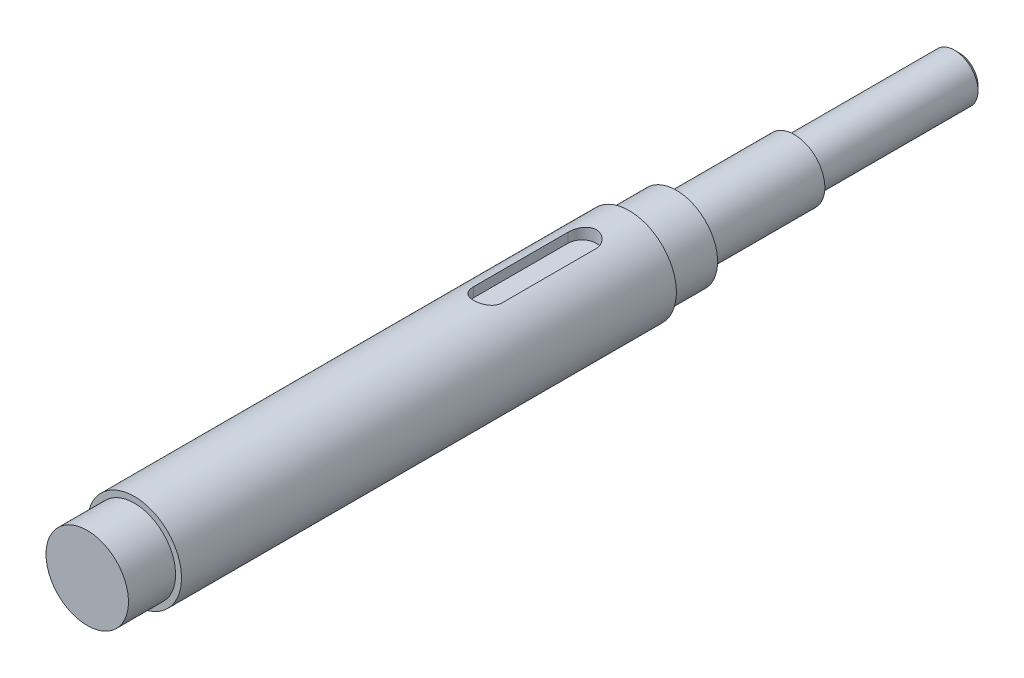
ISO-10303-21;
HEADER;
FILE_DESCRIPTION(('STEP AP214'),'2;1');
FILE_NAME('part.step','',(''),(''),'','','');
FILE_SCHEMA(('AUTOMOTIVE_DESIGN { 1 0 10303 214 1 1 1 1 }'));
ENDSEC;
DATA;
#1=APPLICATION_CONTEXT('core data for automotive mechanical design processes');
#2=APPLICATION_PROTOCOL_DEFINITION('international standard','automotive_design',2000,#1);
#3=PRODUCT_CONTEXT('',#1,'mechanical');
#4=PRODUCT('Part','Part','',(#3));
#5=PRODUCT_RELATED_PRODUCT_CATEGORY('part','',(#4));
#6=PRODUCT_DEFINITION_FORMATION('','',#4);
#7=PRODUCT_DEFINITION_CONTEXT('part definition',#1,'design');
#8=PRODUCT_DEFINITION('design','',#6,#7);
#9=PRODUCT_DEFINITION_SHAPE('','',#8);
#10=(LENGTH_UNIT() NAMED_UNIT(*) SI_UNIT(.MILLI.,.METRE.));
#11=(NAMED_UNIT(*) PLANE_ANGLE_UNIT() SI_UNIT($,.RADIAN.));
#12=(NAMED_UNIT(*) SI_UNIT($,.STERADIAN.) SOLID_ANGLE_UNIT());
#13=UNCERTAINTY_MEASURE_WITH_UNIT(LENGTH_MEASURE(1.E-05),#10,'distance_accuracy_value','');
#14=(GEOMETRIC_REPRESENTATION_CONTEXT(3) GLOBAL_UNCERTAINTY_ASSIGNED_CONTEXT((#13)) GLOBAL_UNIT_ASSIGNED_CONTEXT((#10,
#11,#12)) REPRESENTATION_CONTEXT('',''));
#15=CARTESIAN_POINT('',(0.,0.,0.));
#16=DIRECTION('',(0.,0.,1.));
#17=DIRECTION('',(1.,0.,0.));
#18=AXIS2_PLACEMENT_3D('',#15,#16,#17);
#19=CARTESIAN_POINT('',(0.,0.,0.));
#20=DIRECTION('',(0.,0.,-1.));
#21=DIRECTION('',(-1.,0.,0.));
#22=AXIS2_PLACEMENT_3D('',#19,#20,#21);
#23=CYLINDRICAL_SURFACE('',#22,20.);
#24=CARTESIAN_POINT('',(0.,0.,140.));
#25=DIRECTION('',(0.,0.,-1.));
#26=DIRECTION('',(-1.,0.,0.));
#27=AXIS2_PLACEMENT_3D('',#24,#25,#26);
#28=CIRCLE('',#27,20.);
#29=CARTESIAN_POINT('',(-20.,0.,140.));
#30=VERTEX_POINT('',#29);
#31=EDGE_CURVE('E116',#30,#30,#28,.T.);
#32=ORIENTED_EDGE('',*,*,#31,.F.);
#33=EDGE_LOOP('',(#32));
#34=FACE_BOUND('',#33,.T.);
#35=CARTESIAN_POINT('',(0.,0.,350.));
#36=DIRECTION('',(0.,0.,-1.));
#37=DIRECTION('',(-1.,0.,0.));
#38=AXIS2_PLACEMENT_3D('',#35,#36,#37);
#39=CIRCLE('',#38,20.);
#40=CARTESIAN_POINT('',(-20.,0.,350.));
#41=VERTEX_POINT('',#40);
#42=EDGE_CURVE('E113',#41,#41,#39,.T.);
#43=ORIENTED_EDGE('',*,*,#42,.T.);
#44=EDGE_LOOP('',(#43));
#45=FACE_BOUND('',#44,.T.);
#46=CARTESIAN_POINT('',(-5.99999999999998,19.0787840283389,200.));
#47=CARTESIAN_POINT('',(-6.00002230630952,19.0787603919218,200.164667994911));
#48=CARTESIAN_POINT('',(-5.99322212828859,19.0809150948054,200.32932738693));
#49=CARTESIAN_POINT('',(-5.96614198358436,19.089408588524,200.657389428385));
#50=CARTESIAN_POINT('',(-5.94586504749981,19.0957464386677,200.820792352014));
#51=CARTESIAN_POINT('',(-5.89206455668657,19.1124126760415,201.144766793684));
#52=CARTESIAN_POINT('',(-5.85857463708936,19.1227309292375,201.305344427964));
#53=CARTESIAN_POINT('',(-5.77865096251376,19.1470349488515,201.622962308668));
#54=CARTESIAN_POINT('',(-5.73221686903429,19.1610208111801,201.780002462469));
#55=CARTESIAN_POINT('',(-5.62682620459482,19.1922338155173,202.089382560724));
#56=CARTESIAN_POINT('',(-5.56787702452551,19.2094590438083,202.241725218776));
#57=CARTESIAN_POINT('',(-5.43788252899623,19.2466621419291,202.540874142902));
#58=CARTESIAN_POINT('',(-5.36683271334056,19.2666410353108,202.687678324328));
#59=CARTESIAN_POINT('',(-5.21317247195194,19.3087849542851,202.974784945253));
#60=CARTESIAN_POINT('',(-5.13056139609832,19.3309501027959,203.11508701853));
#61=CARTESIAN_POINT('',(-4.95431913401972,19.3768680311909,203.388387798675));
#62=CARTESIAN_POINT('',(-4.8606837822377,19.4006214097184,203.521383716872));
#63=CARTESIAN_POINT('',(-4.66024014290222,19.4497584548899,203.78286357323));
#64=CARTESIAN_POINT('',(-4.55313526362688,19.4751691904069,203.911115152198));
#65=CARTESIAN_POINT('',(-4.32860344600264,19.5263015189751,204.158253937009));
#66=CARTESIAN_POINT('',(-4.21117292654717,19.5520232171847,204.277137866671));
#67=CARTESIAN_POINT('',(-3.9667605919859,19.6030710031715,204.504741395122));
#68=CARTESIAN_POINT('',(-3.83977871873936,19.6283970885393,204.613460932029));
#69=CARTESIAN_POINT('',(-3.57705696576208,19.6779706962222,204.820019254472));
#70=CARTESIAN_POINT('',(-3.44131715512967,19.7022182270443,204.917858125839));
#71=CARTESIAN_POINT('',(-3.15899953964075,19.7494715734221,205.10390976826));
#72=CARTESIAN_POINT('',(-3.01225429870652,19.7724407517412,205.191878046302));
#73=CARTESIAN_POINT('',(-2.7115571779805,19.8159158974823,205.355063794055));
#74=CARTESIAN_POINT('',(-2.55760798995094,19.8364227748921,205.430285978567));
#75=CARTESIAN_POINT('',(-2.24348996032479,19.8744001644265,205.567416439371));
#76=CARTESIAN_POINT('',(-2.08331997555616,19.8918701152059,205.629322254768));
#77=CARTESIAN_POINT('',(-1.7580143048477,19.923254535561,205.739237502456));
#78=CARTESIAN_POINT('',(-1.59288079897387,19.9371705413066,205.787252939968));
#79=CARTESIAN_POINT('',(-1.26354510595572,19.960709769643,205.867825546728));
#80=CARTESIAN_POINT('',(-1.09944808925076,19.9704430293701,205.900780626958));
#81=CARTESIAN_POINT('',(-0.768952154148924,19.9858966495547,205.952871997286));
#82=CARTESIAN_POINT('',(-0.602554181799271,19.9916186120195,205.972013804135));
#83=CARTESIAN_POINT('',(-0.268644299740207,19.9988929276978,205.996319964857));
#84=CARTESIAN_POINT('',(-0.101132356360953,20.0004451543012,206.001483894306));
#85=CARTESIAN_POINT('',(0.233720900410883,19.9993350985709,205.997783594922));
#86=CARTESIAN_POINT('',(0.401062216878525,19.9966728935831,205.988919623537));
#87=CARTESIAN_POINT('',(0.728949940400331,19.9873626800314,205.957757788398));
#88=CARTESIAN_POINT('',(0.889542117296676,19.9808452710305,205.935899990017));
#89=CARTESIAN_POINT('',(1.20830021014908,19.9641050678088,205.879304518242));
#90=CARTESIAN_POINT('',(1.36646528055416,19.9538810115069,205.844562457775));
#91=CARTESIAN_POINT('',(1.6791746181894,19.9300014175933,205.76250769839));
#92=CARTESIAN_POINT('',(1.83372008335734,19.916347033335,205.715199224277));
#93=CARTESIAN_POINT('',(2.13828018933736,19.885954581515,205.608369728937));
#94=CARTESIAN_POINT('',(2.28829310223872,19.8692153547843,205.548844116003));
#95=CARTESIAN_POINT('',(2.58443507880943,19.8328818557961,205.417309420461));
#96=CARTESIAN_POINT('',(2.73050124822122,19.8132575095082,205.345167102802));
#97=CARTESIAN_POINT('',(3.01609632375422,19.7717979578185,205.189376852671));
#98=CARTESIAN_POINT('',(3.15562296424242,19.7499619943591,205.105724971616));
#99=CARTESIAN_POINT('',(3.42724384686893,19.704643118031,204.927513017559));
#100=CARTESIAN_POINT('',(3.55933800314029,19.681160186142,204.832952818572));
#101=CARTESIAN_POINT('',(3.81531376455358,19.6331439703208,204.633541321571));
#102=CARTESIAN_POINT('',(3.93919513006486,19.6086106557752,204.528689723499));
#103=CARTESIAN_POINT('',(4.18263653591653,19.5581593507452,204.305102756537));
#104=CARTESIAN_POINT('',(4.30184428600936,19.5322244988475,204.185987320526));
#105=CARTESIAN_POINT('',(4.52981041510269,19.4806179410542,203.938166496498));
#106=CARTESIAN_POINT('',(4.63857214120817,19.454946153239,203.809464203919));
#107=CARTESIAN_POINT('',(4.84504126060966,19.4045581786367,203.543159603762));
#108=CARTESIAN_POINT('',(4.94274124635233,19.3798426394128,203.405551428099));
#109=CARTESIAN_POINT('',(5.12628631686325,19.3321023379674,203.122440907667));
#110=CARTESIAN_POINT('',(5.21213600998878,19.3090769201297,202.976941662422));
#111=CARTESIAN_POINT('',(5.37223080367568,19.2651525602885,202.677364864907));
#112=CARTESIAN_POINT('',(5.44634371437403,19.2442786555291,202.523212921341));
#113=CARTESIAN_POINT('',(5.58122691640505,19.2055937237889,202.208878158639));
#114=CARTESIAN_POINT('',(5.64200266456206,19.1877814448102,202.048697837522));
#115=CARTESIAN_POINT('',(5.74966145349633,19.1557967477957,201.72356788165));
#116=CARTESIAN_POINT('',(5.79655912825489,19.1416204978023,201.558623473437));
#117=CARTESIAN_POINT('',(5.87609462586439,19.1173543231183,201.225106819549));
#118=CARTESIAN_POINT('',(5.90873902604378,19.1072625137754,201.056536284952));
#119=CARTESIAN_POINT('',(5.95603131732403,19.0925703406668,200.740062929764));
#120=CARTESIAN_POINT('',(5.97251971262427,19.0874107715083,200.59245829064));
#121=CARTESIAN_POINT('',(5.99450261914157,19.0805126306352,200.296572887525));
#122=CARTESIAN_POINT('',(6.0000132954551,19.0787690288453,200.148293440425));
#123=CARTESIAN_POINT('',(6.00000000000002,19.0787840283389,200.));
#124=B_SPLINE_CURVE_WITH_KNOTS('',3,(#46,#47,#48,#49,#50,#51,#52,#53,#54,#55,#56,#57,#58,#59,
#60,#61,#62,#63,#64,#65,#66,#67,#68,#69,#70,#71,#72,#73,#74,#75,#76,#77,#78,#79,#80,#81,#82,#83,
#84,#85,#86,#87,#88,#89,#90,#91,#92,#93,#94,#95,#96,#97,#98,#99,#100,#101,#102,#103,#104,#105,
#106,#107,#108,#109,#110,#111,#112,#113,#114,#115,#116,#117,#118,#119,#120,#121,#122,#123),
.UNSPECIFIED.,.F.,.F.,(4,2,2,2,2,2,2,2,2,2,2,2,2,2,2,2,2,2,2,2,2,2,2,2,2,2,2,2,2,2,2,2,2,2,2,2,
2,2,4),(0.,0.493836284878976,0.987561555412188,1.48003801924602,1.97252736296405,
2.46472666795181,2.95710942192586,3.44951987503682,3.94211698772999,4.44857898474592,
4.95521732942468,5.46185875834846,5.96849619046395,6.48574341264195,7.00279888450886,
7.51994982748061,8.03687685551446,8.5392195832838,9.0413615740179,9.54351881163821,
10.0456668334346,10.531706521874,11.0179118582603,11.5039539397551,11.9901790315928,
12.4818885441265,12.9737671698834,13.4656514771114,13.9575501300996,14.4684682486943,
14.9792221093922,15.4903160010787,16.001210574562,16.5175029344931,17.0335836608614,
17.549118241575,18.0644146711719,18.509813123396,18.9545552237083),.UNSPECIFIED.);
#125=CARTESIAN_POINT('',(-5.99999999999998,19.0787840283389,200.));
#126=VERTEX_POINT('',#125);
#127=CARTESIAN_POINT('',(6.00000000000002,19.0787840283389,200.));
#128=VERTEX_POINT('',#127);
#129=EDGE_CURVE('E134',#126,#128,#124,.T.);
#130=ORIENTED_EDGE('',*,*,#129,.F.);
#131=DIRECTION('',(0.,0.,-1.));
#132=VECTOR('',#131,1.);
#133=CARTESIAN_POINT('',(-5.99999999999998,19.0787840283389,0.));
#134=LINE('',#133,#132);
#135=CARTESIAN_POINT('',(-5.99999999999998,19.0787840283389,160.));
#136=VERTEX_POINT('',#135);
#137=EDGE_CURVE('E166',#136,#126,#134,.F.);
#138=ORIENTED_EDGE('',*,*,#137,.F.);
#139=CARTESIAN_POINT('',(6.00000000000002,19.0787840283389,160.));
#140=CARTESIAN_POINT('',(6.00002230630955,19.0787603919218,159.835332005089));
#141=CARTESIAN_POINT('',(5.99322212828863,19.0809150948054,159.67067261307));
#142=CARTESIAN_POINT('',(5.9661419835844,19.089408588524,159.342610571615));
#143=CARTESIAN_POINT('',(5.94586504749984,19.0957464386677,159.179207647986));
#144=CARTESIAN_POINT('',(5.8920645566866,19.1124126760415,158.855233206316));
#145=CARTESIAN_POINT('',(5.85857463708938,19.1227309292375,158.694655572036));
#146=CARTESIAN_POINT('',(5.77865096251379,19.1470349488515,158.377037691332));
#147=CARTESIAN_POINT('',(5.73221686903433,19.1610208111801,158.219997537531));
#148=CARTESIAN_POINT('',(5.62682620459486,19.1922338155173,157.910617439276));
#149=CARTESIAN_POINT('',(5.56787702452555,19.2094590438083,157.758274781224));
#150=CARTESIAN_POINT('',(5.43788252899627,19.2466621419291,157.459125857098));
#151=CARTESIAN_POINT('',(5.36683271334059,19.2666410353108,157.312321675672));
#152=CARTESIAN_POINT('',(5.21317247195197,19.3087849542851,157.025215054747));
#153=CARTESIAN_POINT('',(5.13056139609835,19.3309501027959,156.88491298147));
#154=CARTESIAN_POINT('',(4.95431913401976,19.3768680311909,156.611612201325));
#155=CARTESIAN_POINT('',(4.86068378223774,19.4006214097184,156.478616283128));
#156=CARTESIAN_POINT('',(4.66024014290225,19.4497584548899,156.21713642677));
#157=CARTESIAN_POINT('',(4.55313526362691,19.4751691904069,156.088884847802));
#158=CARTESIAN_POINT('',(4.32860344600267,19.5263015189751,155.841746062991));
#159=CARTESIAN_POINT('',(4.21117292654719,19.5520232171847,155.722862133329));
#160=CARTESIAN_POINT('',(3.96676059198593,19.6030710031715,155.495258604878));
#161=CARTESIAN_POINT('',(3.83977871873939,19.6283970885393,155.386539067971));
#162=CARTESIAN_POINT('',(3.57705696576211,19.6779706962222,155.179980745528));
#163=CARTESIAN_POINT('',(3.4413171551297,19.7022182270443,155.082141874161));
#164=CARTESIAN_POINT('',(3.15899953964078,19.7494715734221,154.89609023174));
#165=CARTESIAN_POINT('',(3.01225429870656,19.7724407517412,154.808121953698));
#166=CARTESIAN_POINT('',(2.71155717798054,19.8159158974823,154.644936205945));
#167=CARTESIAN_POINT('',(2.55760798995098,19.8364227748921,154.569714021433));
#168=CARTESIAN_POINT('',(2.24348996032482,19.8744001644265,154.432583560629));
#169=CARTESIAN_POINT('',(2.0833199755562,19.8918701152059,154.370677745232));
#170=CARTESIAN_POINT('',(1.75801430484774,19.923254535561,154.260762497544));
#171=CARTESIAN_POINT('',(1.5928807989739,19.9371705413066,154.212747060032));
#172=CARTESIAN_POINT('',(1.26354510595575,19.960709769643,154.132174453272));
#173=CARTESIAN_POINT('',(1.0994480892508,19.9704430293701,154.099219373042));
#174=CARTESIAN_POINT('',(0.768952154148966,19.9858966495547,154.047128002714));
#175=CARTESIAN_POINT('',(0.602554181799311,19.9916186120195,154.027986195865));
#176=CARTESIAN_POINT('',(0.268644299740248,19.9988929276978,154.003680035143));
#177=CARTESIAN_POINT('',(0.101132356360996,20.0004451543012,153.998516105694));
#178=CARTESIAN_POINT('',(-0.233720900410836,19.9993350985709,154.002216405078));
#179=CARTESIAN_POINT('',(-0.401062216878477,19.9966728935831,154.011080376463));
#180=CARTESIAN_POINT('',(-0.728949940400283,19.9873626800314,154.042242211602));
#181=CARTESIAN_POINT('',(-0.889542117296631,19.9808452710305,154.064100009983));
#182=CARTESIAN_POINT('',(-1.20830021014904,19.9641050678088,154.120695481758));
#183=CARTESIAN_POINT('',(-1.36646528055412,19.9538810115069,154.155437542225));
#184=CARTESIAN_POINT('',(-1.67917461818936,19.9300014175933,154.23749230161));
#185=CARTESIAN_POINT('',(-1.8337200833573,19.916347033335,154.284800775723));
#186=CARTESIAN_POINT('',(-2.13828018933733,19.885954581515,154.391630271063));
#187=CARTESIAN_POINT('',(-2.28829310223869,19.8692153547843,154.451155883997));
#188=CARTESIAN_POINT('',(-2.5844350788094,19.8328818557961,154.582690579539));
#189=CARTESIAN_POINT('',(-2.73050124822118,19.8132575095082,154.654832897198));
#190=CARTESIAN_POINT('',(-3.01609632375419,19.7717979578185,154.810623147329));
#191=CARTESIAN_POINT('',(-3.15562296424239,19.7499619943591,154.894275028384));
#192=CARTESIAN_POINT('',(-3.4272438468689,19.704643118031,155.072486982441));
#193=CARTESIAN_POINT('',(-3.55933800314025,19.681160186142,155.167047181428));
#194=CARTESIAN_POINT('',(-3.81531376455354,19.6331439703208,155.366458678429));
#195=CARTESIAN_POINT('',(-3.93919513006482,19.6086106557752,155.471310276501));
#196=CARTESIAN_POINT('',(-4.1826365359165,19.5581593507452,155.694897243463));
#197=CARTESIAN_POINT('',(-4.30184428600933,19.5322244988475,155.814012679474));
#198=CARTESIAN_POINT('',(-4.52981041510266,19.4806179410542,156.061833503502));
#199=CARTESIAN_POINT('',(-4.63857214120814,19.454946153239,156.190535796081));
#200=CARTESIAN_POINT('',(-4.84504126060963,19.4045581786367,156.456840396238));
#201=CARTESIAN_POINT('',(-4.9427412463523,19.3798426394128,156.594448571901));
#202=CARTESIAN_POINT('',(-5.12628631686322,19.3321023379674,156.877559092333));
#203=CARTESIAN_POINT('',(-5.21213600998876,19.3090769201297,157.023058337578));
#204=CARTESIAN_POINT('',(-5.37223080367565,19.2651525602885,157.322635135093));
#205=CARTESIAN_POINT('',(-5.446343714374,19.2442786555291,157.476787078659));
#206=CARTESIAN_POINT('',(-5.58122691640502,19.2055937237889,157.791121841361));
#207=CARTESIAN_POINT('',(-5.64200266456202,19.1877814448102,157.951302162478));
#208=CARTESIAN_POINT('',(-5.7496614534963,19.1557967477957,158.27643211835));
#209=CARTESIAN_POINT('',(-5.79655912825486,19.1416204978023,158.441376526563));
#210=CARTESIAN_POINT('',(-5.87609462586436,19.1173543231183,158.774893180451));
#211=CARTESIAN_POINT('',(-5.90873902604375,19.1072625137754,158.943463715048));
#212=CARTESIAN_POINT('',(-5.95603131732399,19.0925703406668,159.259937070236));
#213=CARTESIAN_POINT('',(-5.97251971262424,19.0874107715083,159.40754170936));
#214=CARTESIAN_POINT('',(-5.99450261914154,19.0805126306352,159.703427112475));
#215=CARTESIAN_POINT('',(-6.00001329545507,19.0787690288453,159.851706559575));
#216=CARTESIAN_POINT('',(-5.99999999999998,19.0787840283389,160.));
#217=B_SPLINE_CURVE_WITH_KNOTS('',3,(#139,#140,#141,#142,#143,#144,#145,#146,#147,#148,#149,
#150,#151,#152,#153,#154,#155,#156,#157,#158,#159,#160,#161,#162,#163,#164,#165,#166,#167,#168,
#169,#170,#171,#172,#173,#174,#175,#176,#177,#178,#179,#180,#181,#182,#183,#184,#185,#186,#187,
#188,#189,#190,#191,#192,#193,#194,#195,#196,#197,#198,#199,#200,#201,#202,#203,#204,#205,#206,
#207,#208,#209,#210,#211,#212,#213,#214,#215,#216),.UNSPECIFIED.,.F.,.F.,(4,2,2,2,2,2,2,2,2,2,2,
2,2,2,2,2,2,2,2,2,2,2,2,2,2,2,2,2,2,2,2,2,2,2,2,2,2,2,4),(0.,0.493836284878976,
0.987561555412216,1.48003801924605,1.97252736296405,2.46472666795178,2.95710942192586,
3.44951987503682,3.94211698773,4.44857898474593,4.95521732942468,5.46185875834846,
5.96849619046396,6.48574341264193,7.00279888450885,7.5199498274806,8.03687685551445,
8.53921958328378,9.04136157401788,9.54351881163819,10.0456668334346,10.531706521874,
11.0179118582603,11.5039539397551,11.9901790315928,12.4818885441265,12.9737671698834,
13.4656514771114,13.9575501300996,14.4684682486943,14.9792221093922,15.4903160010787,
16.001210574562,16.5175029344931,17.0335836608614,17.549118241575,18.0644146711719,
18.509813123396,18.9545552237083),.UNSPECIFIED.);
#218=CARTESIAN_POINT('',(6.00000000000002,19.0787840283389,160.));
#219=VERTEX_POINT('',#218);
#220=EDGE_CURVE('E62',#219,#136,#217,.T.);
#221=ORIENTED_EDGE('',*,*,#220,.F.);
#222=DIRECTION('',(0.,0.,-1.));
#223=VECTOR('',#222,1.);
#224=CARTESIAN_POINT('',(6.00000000000002,19.0787840283389,0.));
#225=LINE('',#224,#223);
#226=EDGE_CURVE('E100',#128,#219,#225,.T.);
#227=ORIENTED_EDGE('',*,*,#226,.F.);
#228=EDGE_LOOP('',(#130,#138,#221,#227));
#229=FACE_BOUND('',#228,.T.);
#230=ADVANCED_FACE('F39',(#34,#45,#229),#23,.T.);
#231=CARTESIAN_POINT('',(0.,0.,0.));
#232=DIRECTION('',(0.,0.,1.));
#233=DIRECTION('',(1.,0.,0.));
#234=AXIS2_PLACEMENT_3D('',#231,#232,#233);
#235=PLANE('',#234);
#236=CARTESIAN_POINT('',(0.,0.,0.));
#237=DIRECTION('',(0.,0.,1.));
#238=DIRECTION('',(1.,0.,0.));
#239=AXIS2_PLACEMENT_3D('',#236,#237,#238);
#240=CIRCLE('',#239,7.99999999999995);
#241=CARTESIAN_POINT('',(7.99999999999995,0.,0.));
#242=VERTEX_POINT('',#241);
#243=EDGE_CURVE('E48',#242,#242,#240,.F.);
#244=ORIENTED_EDGE('',*,*,#243,.T.);
#245=EDGE_LOOP('',(#244));
#246=FACE_BOUND('',#245,.T.);
#247=ADVANCED_FACE('F170',(#246),#235,.F.);
#248=CARTESIAN_POINT('',(0.,0.,0.));
#249=DIRECTION('',(0.,0.,-1.));
#250=DIRECTION('',(-1.,0.,0.));
#251=AXIS2_PLACEMENT_3D('',#248,#249,#250);
#252=CYLINDRICAL_SURFACE('',#251,10.);
#253=CARTESIAN_POINT('',(0.,0.,2.00000000000003));
#254=DIRECTION('',(0.,0.,1.));
#255=DIRECTION('',(1.,0.,0.));
#256=AXIS2_PLACEMENT_3D('',#253,#254,#255);
#257=CIRCLE('',#256,10.);
#258=CARTESIAN_POINT('',(10.,0.,2.00000000000003));
#259=VERTEX_POINT('',#258);
#260=EDGE_CURVE('E11',#259,#259,#257,.T.);
#261=ORIENTED_EDGE('',*,*,#260,.T.);
#262=EDGE_LOOP('',(#261));
#263=FACE_BOUND('',#262,.T.);
#264=CARTESIAN_POINT('',(0.,0.,70.));
#265=DIRECTION('',(0.,0.,-1.));
#266=DIRECTION('',(-1.,0.,0.));
#267=AXIS2_PLACEMENT_3D('',#264,#265,#266);
#268=CIRCLE('',#267,10.);
#269=CARTESIAN_POINT('',(-9.99999999999999,0.,70.));
#270=VERTEX_POINT('',#269);
#271=EDGE_CURVE('E131',#270,#270,#268,.T.);
#272=ORIENTED_EDGE('',*,*,#271,.T.);
#273=EDGE_LOOP('',(#272));
#274=FACE_BOUND('',#273,.T.);
#275=ADVANCED_FACE('F184',(#263,#274),#252,.T.);
#276=CARTESIAN_POINT('',(10.,0.,70.));
#277=DIRECTION('',(0.,0.,1.));
#278=DIRECTION('',(1.,0.,0.));
#279=AXIS2_PLACEMENT_3D('',#276,#277,#278);
#280=PLANE('',#279);
#281=ORIENTED_EDGE('',*,*,#271,.F.);
#282=EDGE_LOOP('',(#281));
#283=FACE_BOUND('',#282,.T.);
#284=CARTESIAN_POINT('',(0.,0.,70.));
#285=DIRECTION('',(0.,0.,-1.));
#286=DIRECTION('',(-1.,0.,0.));
#287=AXIS2_PLACEMENT_3D('',#284,#285,#286);
#288=CIRCLE('',#287,13.);
#289=CARTESIAN_POINT('',(-13.,0.,70.));
#290=VERTEX_POINT('',#289);
#291=EDGE_CURVE('E128',#290,#290,#288,.T.);
#292=ORIENTED_EDGE('',*,*,#291,.T.);
#293=EDGE_LOOP('',(#292));
#294=FACE_BOUND('',#293,.T.);
#295=ADVANCED_FACE('F219',(#283,#294),#280,.F.);
#296=CARTESIAN_POINT('',(0.,0.,0.));
#297=DIRECTION('',(0.,0.,-1.));
#298=DIRECTION('',(-1.,0.,0.));
#299=AXIS2_PLACEMENT_3D('',#296,#297,#298);
#300=CYLINDRICAL_SURFACE('',#299,13.);
#301=ORIENTED_EDGE('',*,*,#291,.F.);
#302=EDGE_LOOP('',(#301));
#303=FACE_BOUND('',#302,.T.);
#304=CARTESIAN_POINT('',(0.,0.,120.));
#305=DIRECTION('',(0.,0.,-1.));
#306=DIRECTION('',(-1.,0.,0.));
#307=AXIS2_PLACEMENT_3D('',#304,#305,#306);
#308=CIRCLE('',#307,13.);
#309=CARTESIAN_POINT('',(-13.,0.,120.));
#310=VERTEX_POINT('',#309);
#311=EDGE_CURVE('E125',#310,#310,#308,.T.);
#312=ORIENTED_EDGE('',*,*,#311,.T.);
#313=EDGE_LOOP('',(#312));
#314=FACE_BOUND('',#313,.T.);
#315=ADVANCED_FACE('F234',(#303,#314),#300,.T.);
#316=CARTESIAN_POINT('',(13.,0.,120.));
#317=DIRECTION('',(0.,0.,1.));
#318=DIRECTION('',(1.,0.,0.));
#319=AXIS2_PLACEMENT_3D('',#316,#317,#318);
#320=PLANE('',#319);
#321=ORIENTED_EDGE('',*,*,#311,.F.);
#322=EDGE_LOOP('',(#321));
#323=FACE_BOUND('',#322,.T.);
#324=CARTESIAN_POINT('',(0.,0.,120.));
#325=DIRECTION('',(0.,0.,-1.));
#326=DIRECTION('',(-1.,0.,0.));
#327=AXIS2_PLACEMENT_3D('',#324,#325,#326);
#328=CIRCLE('',#327,17.5);
#329=CARTESIAN_POINT('',(-17.5,0.,120.));
#330=VERTEX_POINT('',#329);
#331=EDGE_CURVE('E122',#330,#330,#328,.T.);
#332=ORIENTED_EDGE('',*,*,#331,.T.);
#333=EDGE_LOOP('',(#332));
#334=FACE_BOUND('',#333,.T.);
#335=ADVANCED_FACE('F241',(#323,#334),#320,.F.);
#336=CARTESIAN_POINT('',(0.,0.,0.));
#337=DIRECTION('',(0.,0.,-1.));
#338=DIRECTION('',(-1.,0.,0.));
#339=AXIS2_PLACEMENT_3D('',#336,#337,#338);
#340=CYLINDRICAL_SURFACE('',#339,17.5);
#341=ORIENTED_EDGE('',*,*,#331,.F.);
#342=EDGE_LOOP('',(#341));
#343=FACE_BOUND('',#342,.T.);
#344=CARTESIAN_POINT('',(0.,0.,140.));
#345=DIRECTION('',(0.,0.,-1.));
#346=DIRECTION('',(-1.,0.,0.));
#347=AXIS2_PLACEMENT_3D('',#344,#345,#346);
#348=CIRCLE('',#347,17.5);
#349=CARTESIAN_POINT('',(-17.5,0.,140.));
#350=VERTEX_POINT('',#349);
#351=EDGE_CURVE('E119',#350,#350,#348,.T.);
#352=ORIENTED_EDGE('',*,*,#351,.T.);
#353=EDGE_LOOP('',(#352));
#354=FACE_BOUND('',#353,.T.);
#355=ADVANCED_FACE('F249',(#343,#354),#340,.T.);
#356=CARTESIAN_POINT('',(17.5,0.,140.));
#357=DIRECTION('',(0.,0.,1.));
#358=DIRECTION('',(1.,0.,0.));
#359=AXIS2_PLACEMENT_3D('',#356,#357,#358);
#360=PLANE('',#359);
#361=ORIENTED_EDGE('',*,*,#351,.F.);
#362=EDGE_LOOP('',(#361));
#363=FACE_BOUND('',#362,.T.);
#364=ORIENTED_EDGE('',*,*,#31,.T.);
#365=EDGE_LOOP('',(#364));
#366=FACE_BOUND('',#365,.T.);
#367=ADVANCED_FACE('F257',(#363,#366),#360,.F.);
#368=CARTESIAN_POINT('',(20.,0.,350.));
#369=DIRECTION('',(0.,0.,-1.));
#370=DIRECTION('',(-1.,0.,0.));
#371=AXIS2_PLACEMENT_3D('',#368,#369,#370);
#372=PLANE('',#371);
#373=ORIENTED_EDGE('',*,*,#42,.F.);
#374=EDGE_LOOP('',(#373));
#375=FACE_BOUND('',#374,.T.);
#376=CARTESIAN_POINT('',(0.,0.,350.));
#377=DIRECTION('',(0.,0.,-1.));
#378=DIRECTION('',(-1.,0.,0.));
#379=AXIS2_PLACEMENT_3D('',#376,#377,#378);
#380=CIRCLE('',#379,17.5);
#381=CARTESIAN_POINT('',(-17.5,0.,350.));
#382=VERTEX_POINT('',#381);
#383=EDGE_CURVE('E105',#382,#382,#380,.T.);
#384=ORIENTED_EDGE('',*,*,#383,.T.);
#385=EDGE_LOOP('',(#384));
#386=FACE_BOUND('',#385,.T.);
#387=ADVANCED_FACE('F265',(#375,#386),#372,.F.);
#388=CARTESIAN_POINT('',(0.,0.,0.));
#389=DIRECTION('',(0.,0.,-1.));
#390=DIRECTION('',(-1.,0.,0.));
#391=AXIS2_PLACEMENT_3D('',#388,#389,#390);
#392=CYLINDRICAL_SURFACE('',#391,17.5);
#393=ORIENTED_EDGE('',*,*,#383,.F.);
#394=EDGE_LOOP('',(#393));
#395=FACE_BOUND('',#394,.T.);
#396=CARTESIAN_POINT('',(0.,0.,370.));
#397=DIRECTION('',(0.,0.,-1.));
#398=DIRECTION('',(-1.,0.,0.));
#399=AXIS2_PLACEMENT_3D('',#396,#397,#398);
#400=CIRCLE('',#399,17.5);
#401=CARTESIAN_POINT('',(-17.5,0.,370.));
#402=VERTEX_POINT('',#401);
#403=EDGE_CURVE('E101',#402,#402,#400,.T.);
#404=ORIENTED_EDGE('',*,*,#403,.T.);
#405=EDGE_LOOP('',(#404));
#406=FACE_BOUND('',#405,.T.);
#407=ADVANCED_FACE('F272',(#395,#406),#392,.T.);
#408=CARTESIAN_POINT('',(17.5,0.,370.));
#409=DIRECTION('',(0.,0.,-1.));
#410=DIRECTION('',(-1.,0.,0.));
#411=AXIS2_PLACEMENT_3D('',#408,#409,#410);
#412=PLANE('',#411);
#413=ORIENTED_EDGE('',*,*,#403,.F.);
#414=EDGE_LOOP('',(#413));
#415=FACE_BOUND('',#414,.T.);
#416=ADVANCED_FACE('F159',(#415),#412,.F.);
#417=CARTESIAN_POINT('',(0.,14.9999999999999,160.));
#418=DIRECTION('',(0.,1.,0.));
#419=DIRECTION('',(0.,0.,1.));
#420=AXIS2_PLACEMENT_3D('',#417,#418,#419);
#421=CYLINDRICAL_SURFACE('',#420,6.);
#422=DIRECTION('',(0.,1.,0.));
#423=VECTOR('',#422,1.);
#424=CARTESIAN_POINT('',(6.00000000000002,14.9999999999999,160.));
#425=LINE('',#424,#423);
#426=CARTESIAN_POINT('',(6.00000000000002,14.9999999999999,160.));
#427=VERTEX_POINT('',#426);
#428=EDGE_CURVE('E97',#427,#219,#425,.T.);
#429=ORIENTED_EDGE('',*,*,#428,.T.);
#430=ORIENTED_EDGE('',*,*,#220,.T.);
#431=DIRECTION('',(0.,1.,0.));
#432=VECTOR('',#431,1.);
#433=CARTESIAN_POINT('',(-5.99999999999998,14.9999999999999,160.));
#434=LINE('',#433,#432);
#435=CARTESIAN_POINT('',(-5.99999999999998,14.9999999999999,160.));
#436=VERTEX_POINT('',#435);
#437=EDGE_CURVE('E55',#436,#136,#434,.T.);
#438=ORIENTED_EDGE('',*,*,#437,.F.);
#439=CARTESIAN_POINT('',(0.,14.9999999999999,160.));
#440=DIRECTION('',(0.,-1.,0.));
#441=DIRECTION('',(0.,0.,1.));
#442=AXIS2_PLACEMENT_3D('',#439,#440,#441);
#443=CIRCLE('',#442,6.);
#444=EDGE_CURVE('E87',#436,#427,#443,.T.);
#445=ORIENTED_EDGE('',*,*,#444,.T.);
#446=EDGE_LOOP('',(#429,#430,#438,#445));
#447=FACE_BOUND('',#446,.T.);
#448=ADVANCED_FACE('F96',(#447),#421,.F.);
#449=CARTESIAN_POINT('',(6.00000000000002,14.9999999999999,160.));
#450=DIRECTION('',(-1.,0.,0.));
#451=DIRECTION('',(0.,0.,1.));
#452=AXIS2_PLACEMENT_3D('',#449,#450,#451);
#453=PLANE('',#452);
#454=ORIENTED_EDGE('',*,*,#226,.T.);
#455=ORIENTED_EDGE('',*,*,#428,.F.);
#456=DIRECTION('',(0.,0.,1.));
#457=VECTOR('',#456,1.);
#458=CARTESIAN_POINT('',(6.00000000000002,14.9999999999999,160.));
#459=LINE('',#458,#457);
#460=CARTESIAN_POINT('',(6.00000000000002,14.9999999999996,200.));
#461=VERTEX_POINT('',#460);
#462=EDGE_CURVE('E83',#427,#461,#459,.T.);
#463=ORIENTED_EDGE('',*,*,#462,.T.);
#464=DIRECTION('',(0.,1.,0.));
#465=VECTOR('',#464,1.);
#466=CARTESIAN_POINT('',(6.00000000000002,14.9999999999996,200.));
#467=LINE('',#466,#465);
#468=EDGE_CURVE('E102',#461,#128,#467,.T.);
#469=ORIENTED_EDGE('',*,*,#468,.T.);
#470=EDGE_LOOP('',(#454,#455,#463,#469));
#471=FACE_BOUND('',#470,.T.);
#472=ADVANCED_FACE('F99',(#471),#453,.T.);
#473=CARTESIAN_POINT('',(0.,14.9999999999996,200.));
#474=DIRECTION('',(0.,1.,0.));
#475=DIRECTION('',(0.,0.,1.));
#476=AXIS2_PLACEMENT_3D('',#473,#474,#475);
#477=CYLINDRICAL_SURFACE('',#476,6.);
#478=DIRECTION('',(0.,1.,0.));
#479=VECTOR('',#478,1.);
#480=CARTESIAN_POINT('',(-5.99999999999998,14.9999999999996,200.));
#481=LINE('',#480,#479);
#482=CARTESIAN_POINT('',(-5.99999999999998,14.9999999999996,200.));
#483=VERTEX_POINT('',#482);
#484=EDGE_CURVE('E107',#483,#126,#481,.T.);
#485=ORIENTED_EDGE('',*,*,#484,.T.);
#486=ORIENTED_EDGE('',*,*,#129,.T.);
#487=ORIENTED_EDGE('',*,*,#468,.F.);
#488=CARTESIAN_POINT('',(0.,14.9999999999996,200.));
#489=DIRECTION('',(0.,-1.,0.));
#490=DIRECTION('',(0.,0.,-1.));
#491=AXIS2_PLACEMENT_3D('',#488,#489,#490);
#492=CIRCLE('',#491,6.);
#493=EDGE_CURVE('E88',#461,#483,#492,.T.);
#494=ORIENTED_EDGE('',*,*,#493,.T.);
#495=EDGE_LOOP('',(#485,#486,#487,#494));
#496=FACE_BOUND('',#495,.T.);
#497=ADVANCED_FACE('F146',(#496),#477,.F.);
#498=CARTESIAN_POINT('',(-5.99999999999998,14.9999999999999,160.));
#499=DIRECTION('',(1.,0.,0.));
#500=DIRECTION('',(0.,0.,-1.));
#501=AXIS2_PLACEMENT_3D('',#498,#499,#500);
#502=PLANE('',#501);
#503=ORIENTED_EDGE('',*,*,#137,.T.);
#504=ORIENTED_EDGE('',*,*,#484,.F.);
#505=DIRECTION('',(0.,0.,-1.));
#506=VECTOR('',#505,1.);
#507=CARTESIAN_POINT('',(-5.99999999999998,14.9999999999999,160.));
#508=LINE('',#507,#506);
#509=EDGE_CURVE('E190',#483,#436,#508,.T.);
#510=ORIENTED_EDGE('',*,*,#509,.T.);
#511=ORIENTED_EDGE('',*,*,#437,.T.);
#512=EDGE_LOOP('',(#503,#504,#510,#511));
#513=FACE_BOUND('',#512,.T.);
#514=ADVANCED_FACE('F151',(#513),#502,.T.);
#515=CARTESIAN_POINT('',(0.,14.9999999999999,160.));
#516=DIRECTION('',(0.,1.,0.));
#517=DIRECTION('',(0.,0.,1.));
#518=AXIS2_PLACEMENT_3D('',#515,#516,#517);
#519=PLANE('',#518);
#520=ORIENTED_EDGE('',*,*,#444,.F.);
#521=ORIENTED_EDGE('',*,*,#509,.F.);
#522=ORIENTED_EDGE('',*,*,#493,.F.);
#523=ORIENTED_EDGE('',*,*,#462,.F.);
#524=EDGE_LOOP('',(#520,#521,#522,#523));
#525=FACE_BOUND('',#524,.T.);
#526=ADVANCED_FACE('F85',(#525),#519,.T.);
#527=CARTESIAN_POINT('',(0.,0.,0.));
#528=DIRECTION('',(0.,0.,1.));
#529=DIRECTION('',(1.,0.,0.));
#530=AXIS2_PLACEMENT_3D('',#527,#528,#529);
#531=CONICAL_SURFACE('',#530,7.99999999999995,0.785398163397453);
#532=ORIENTED_EDGE('',*,*,#260,.F.);
#533=EDGE_LOOP('',(#532));
#534=FACE_BOUND('',#533,.T.);
#535=ORIENTED_EDGE('',*,*,#243,.F.);
#536=EDGE_LOOP('',(#535));
#537=FACE_BOUND('',#536,.T.);
#538=ADVANCED_FACE('F42',(#534,#537),#531,.T.);
#539=CLOSED_SHELL('',(#230,#247,#275,#295,#315,#335,#355,#367,#387,#407,#416,#448,#472,#497,
#514,#526,#538));
#540=MANIFOLD_SOLID_BREP('B2',#539);
#541=ADVANCED_BREP_SHAPE_REPRESENTATION('',(#18,#540),#14);
#542=SHAPE_DEFINITION_REPRESENTATION(#9,#541);
ENDSEC;
END-ISO-10303-21;
